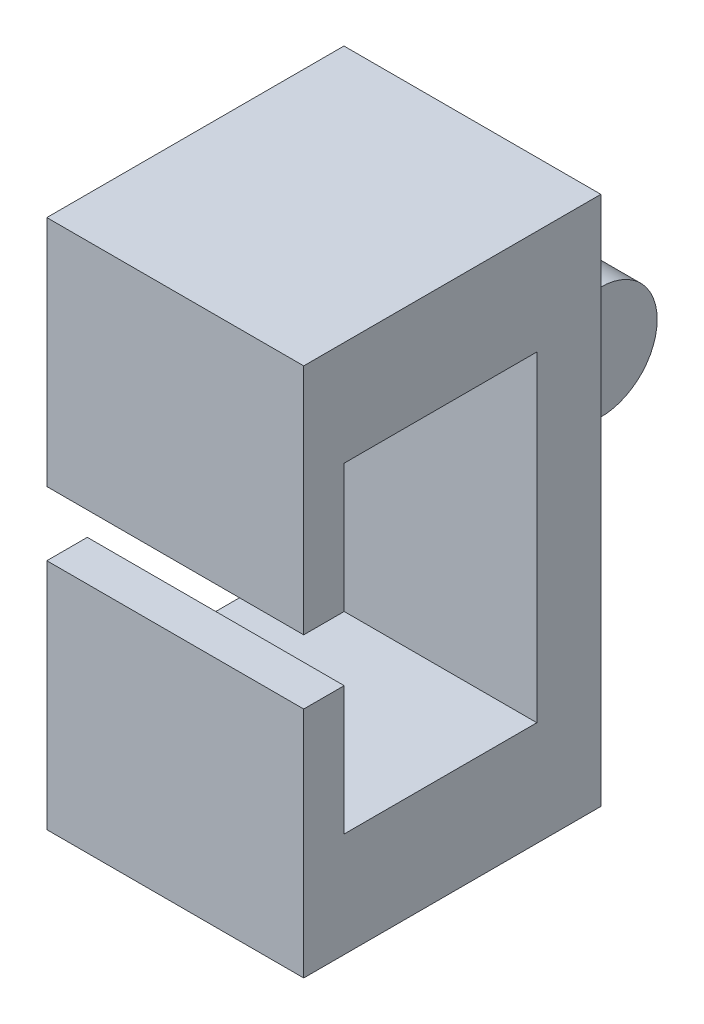
ISO-10303-21;
HEADER;
FILE_DESCRIPTION(('STEP AP214'),'2;1');
FILE_NAME('part.step','',(''),(''),'','','');
FILE_SCHEMA(('AUTOMOTIVE_DESIGN { 1 0 10303 214 1 1 1 1 }'));
ENDSEC;
DATA;
#1=APPLICATION_CONTEXT('core data for automotive mechanical design processes');
#2=APPLICATION_PROTOCOL_DEFINITION('international standard','automotive_design',2000,#1);
#3=PRODUCT_CONTEXT('',#1,'mechanical');
#4=PRODUCT('Part','Part','',(#3));
#5=PRODUCT_RELATED_PRODUCT_CATEGORY('part','',(#4));
#6=PRODUCT_DEFINITION_FORMATION('','',#4);
#7=PRODUCT_DEFINITION_CONTEXT('part definition',#1,'design');
#8=PRODUCT_DEFINITION('design','',#6,#7);
#9=PRODUCT_DEFINITION_SHAPE('','',#8);
#10=(LENGTH_UNIT() NAMED_UNIT(*) SI_UNIT(.MILLI.,.METRE.));
#11=(NAMED_UNIT(*) PLANE_ANGLE_UNIT() SI_UNIT($,.RADIAN.));
#12=(NAMED_UNIT(*) SI_UNIT($,.STERADIAN.) SOLID_ANGLE_UNIT());
#13=UNCERTAINTY_MEASURE_WITH_UNIT(LENGTH_MEASURE(1.E-05),#10,'distance_accuracy_value','');
#14=(GEOMETRIC_REPRESENTATION_CONTEXT(3) GLOBAL_UNCERTAINTY_ASSIGNED_CONTEXT((#13)) GLOBAL_UNIT_ASSIGNED_CONTEXT((#10,
#11,#12)) REPRESENTATION_CONTEXT('',''));
#15=CARTESIAN_POINT('',(0.,0.,0.));
#16=DIRECTION('',(0.,0.,1.));
#17=DIRECTION('',(1.,0.,0.));
#18=AXIS2_PLACEMENT_3D('',#15,#16,#17);
#19=CARTESIAN_POINT('',(25.4,0.,0.));
#20=DIRECTION('',(-1.,0.,0.));
#21=DIRECTION('',(0.,0.,1.));
#22=AXIS2_PLACEMENT_3D('',#19,#20,#21);
#23=CYLINDRICAL_SURFACE('',#22,11.1361216276526);
#24=CARTESIAN_POINT('',(25.4,0.,0.));
#25=DIRECTION('',(1.,0.,0.));
#26=DIRECTION('',(0.,0.,-1.));
#27=AXIS2_PLACEMENT_3D('',#24,#25,#26);
#28=CIRCLE('',#27,11.1361216276526);
#29=CARTESIAN_POINT('',(25.4,0.,-11.1361216276526));
#30=VERTEX_POINT('',#29);
#31=EDGE_CURVE('E153',#30,#30,#28,.T.);
#32=ORIENTED_EDGE('',*,*,#31,.F.);
#33=EDGE_LOOP('',(#32));
#34=FACE_BOUND('',#33,.T.);
#35=DIRECTION('',(-1.,0.,0.));
#36=VECTOR('',#35,1.);
#37=CARTESIAN_POINT('',(3.83463556575211,11.1361216276526,0.));
#38=LINE('',#37,#36);
#39=CARTESIAN_POINT('',(3.83463556575211,11.1361216276526,0.));
#40=VERTEX_POINT('',#39);
#41=CARTESIAN_POINT('',(0.,11.1361216276526,0.));
#42=VERTEX_POINT('',#41);
#43=EDGE_CURVE('E399',#40,#42,#38,.T.);
#44=ORIENTED_EDGE('',*,*,#43,.F.);
#45=CARTESIAN_POINT('',(3.83463556575211,0.,0.));
#46=DIRECTION('',(-1.,0.,0.));
#47=DIRECTION('',(0.,0.,1.));
#48=AXIS2_PLACEMENT_3D('',#45,#46,#47);
#49=CIRCLE('',#48,11.1361216276526);
#50=CARTESIAN_POINT('',(3.83463556575211,-11.1252,0.493082007248803));
#51=VERTEX_POINT('',#50);
#52=EDGE_CURVE('E13',#51,#40,#49,.T.);
#53=ORIENTED_EDGE('',*,*,#52,.F.);
#54=DIRECTION('',(-1.,0.,0.));
#55=VECTOR('',#54,1.);
#56=CARTESIAN_POINT('',(25.4,-11.1252,0.493082007248858));
#57=LINE('',#56,#55);
#58=CARTESIAN_POINT('',(0.,-11.1252,0.493082007248803));
#59=VERTEX_POINT('',#58);
#60=EDGE_CURVE('E161',#51,#59,#57,.T.);
#61=ORIENTED_EDGE('',*,*,#60,.T.);
#62=CARTESIAN_POINT('',(0.,0.,0.));
#63=DIRECTION('',(1.,0.,0.));
#64=DIRECTION('',(0.,0.,-1.));
#65=AXIS2_PLACEMENT_3D('',#62,#63,#64);
#66=CIRCLE('',#65,11.1361216276526);
#67=EDGE_CURVE('E408',#59,#42,#66,.T.);
#68=ORIENTED_EDGE('',*,*,#67,.T.);
#69=EDGE_LOOP('',(#44,#53,#61,#68));
#70=FACE_BOUND('',#69,.T.);
#71=ADVANCED_FACE('F143',(#34,#70),#23,.T.);
#72=CARTESIAN_POINT('',(25.4,0.,0.));
#73=DIRECTION('',(1.,0.,0.));
#74=DIRECTION('',(0.,0.,-1.));
#75=AXIS2_PLACEMENT_3D('',#72,#73,#74);
#76=PLANE('',#75);
#77=ORIENTED_EDGE('',*,*,#31,.T.);
#78=EDGE_LOOP('',(#77));
#79=FACE_BOUND('',#78,.T.);
#80=ADVANCED_FACE('F552',(#79),#76,.T.);
#81=CARTESIAN_POINT('',(0.,0.,0.));
#82=DIRECTION('',(1.,0.,0.));
#83=DIRECTION('',(0.,0.,-1.));
#84=AXIS2_PLACEMENT_3D('',#81,#82,#83);
#85=PLANE('',#84);
#86=ORIENTED_EDGE('',*,*,#67,.F.);
#87=DIRECTION('',(0.,0.,1.));
#88=VECTOR('',#87,1.);
#89=CARTESIAN_POINT('',(0.,-11.1252,0.));
#90=LINE('',#89,#88);
#91=CARTESIAN_POINT('',(0.,-11.1252,25.4));
#92=VERTEX_POINT('',#91);
#93=EDGE_CURVE('E378',#59,#92,#90,.T.);
#94=ORIENTED_EDGE('',*,*,#93,.T.);
#95=DIRECTION('',(0.,1.,0.));
#96=VECTOR('',#95,1.);
#97=CARTESIAN_POINT('',(0.,-31.75,25.4));
#98=LINE('',#97,#96);
#99=CARTESIAN_POINT('',(0.,-52.4146964792465,25.4));
#100=VERTEX_POINT('',#99);
#101=EDGE_CURVE('E366',#100,#92,#98,.T.);
#102=ORIENTED_EDGE('',*,*,#101,.F.);
#103=DIRECTION('',(0.,0.,-1.));
#104=VECTOR('',#103,1.);
#105=CARTESIAN_POINT('',(0.,-52.4146964792465,25.4));
#106=LINE('',#105,#104);
#107=CARTESIAN_POINT('',(0.,-52.4146964792465,84.1578930477657));
#108=VERTEX_POINT('',#107);
#109=EDGE_CURVE('E467',#108,#100,#106,.T.);
#110=ORIENTED_EDGE('',*,*,#109,.F.);
#111=DIRECTION('',(0.,-1.,0.));
#112=VECTOR('',#111,1.);
#113=CARTESIAN_POINT('',(0.,-52.4146964792465,84.1578930477657));
#114=LINE('',#113,#112);
#115=CARTESIAN_POINT('',(0.,-6.35,84.1578930477657));
#116=VERTEX_POINT('',#115);
#117=EDGE_CURVE('E269',#116,#108,#114,.T.);
#118=ORIENTED_EDGE('',*,*,#117,.F.);
#119=DIRECTION('',(0.,0.,1.));
#120=VECTOR('',#119,1.);
#121=CARTESIAN_POINT('',(0.,-6.35,76.1544905159104));
#122=LINE('',#121,#120);
#123=CARTESIAN_POINT('',(0.,-6.35,76.1544905159104));
#124=VERTEX_POINT('',#123);
#125=EDGE_CURVE('E295',#124,#116,#122,.T.);
#126=ORIENTED_EDGE('',*,*,#125,.F.);
#127=DIRECTION('',(0.,1.,0.));
#128=VECTOR('',#127,1.);
#129=CARTESIAN_POINT('',(0.,-52.4146964792465,76.1544905159105));
#130=LINE('',#129,#128);
#131=CARTESIAN_POINT('',(0.,-31.75,76.1544905159105));
#132=VERTEX_POINT('',#131);
#133=EDGE_CURVE('E271',#132,#124,#130,.T.);
#134=ORIENTED_EDGE('',*,*,#133,.F.);
#135=DIRECTION('',(0.,0.,1.));
#136=VECTOR('',#135,1.);
#137=CARTESIAN_POINT('',(0.,-31.75,25.4));
#138=LINE('',#137,#136);
#139=CARTESIAN_POINT('',(0.,-31.75,38.0544905159105));
#140=VERTEX_POINT('',#139);
#141=EDGE_CURVE('E350',#140,#132,#138,.T.);
#142=ORIENTED_EDGE('',*,*,#141,.F.);
#143=DIRECTION('',(0.,-1.,0.));
#144=VECTOR('',#143,1.);
#145=CARTESIAN_POINT('',(0.,-31.75,38.0544905159105));
#146=LINE('',#145,#144);
#147=CARTESIAN_POINT('',(0.,31.75,38.0544905159105));
#148=VERTEX_POINT('',#147);
#149=EDGE_CURVE('E365',#148,#140,#146,.T.);
#150=ORIENTED_EDGE('',*,*,#149,.F.);
#151=DIRECTION('',(0.,0.,-1.));
#152=VECTOR('',#151,1.);
#153=CARTESIAN_POINT('',(0.,31.75,25.4));
#154=LINE('',#153,#152);
#155=CARTESIAN_POINT('',(0.,31.75,76.1544905159105));
#156=VERTEX_POINT('',#155);
#157=EDGE_CURVE('E345',#156,#148,#154,.T.);
#158=ORIENTED_EDGE('',*,*,#157,.F.);
#159=DIRECTION('',(0.,1.,0.));
#160=VECTOR('',#159,1.);
#161=CARTESIAN_POINT('',(0.,52.4146964792465,76.1544905159105));
#162=LINE('',#161,#160);
#163=CARTESIAN_POINT('',(0.,6.35,76.1544905159105));
#164=VERTEX_POINT('',#163);
#165=EDGE_CURVE('E322',#164,#156,#162,.T.);
#166=ORIENTED_EDGE('',*,*,#165,.F.);
#167=DIRECTION('',(0.,0.,-1.));
#168=VECTOR('',#167,1.);
#169=CARTESIAN_POINT('',(0.,6.35,76.1544905159105));
#170=LINE('',#169,#168);
#171=CARTESIAN_POINT('',(0.,6.35,84.1578930477657));
#172=VERTEX_POINT('',#171);
#173=EDGE_CURVE('E321',#172,#164,#170,.T.);
#174=ORIENTED_EDGE('',*,*,#173,.F.);
#175=DIRECTION('',(0.,-1.,0.));
#176=VECTOR('',#175,1.);
#177=CARTESIAN_POINT('',(0.,52.4146964792465,84.1578930477657));
#178=LINE('',#177,#176);
#179=CARTESIAN_POINT('',(0.,52.4146964792465,84.1578930477657));
#180=VERTEX_POINT('',#179);
#181=EDGE_CURVE('E294',#180,#172,#178,.T.);
#182=ORIENTED_EDGE('',*,*,#181,.F.);
#183=DIRECTION('',(0.,0.,1.));
#184=VECTOR('',#183,1.);
#185=CARTESIAN_POINT('',(0.,52.4146964792465,25.4));
#186=LINE('',#185,#184);
#187=CARTESIAN_POINT('',(0.,52.4146964792465,25.4));
#188=VERTEX_POINT('',#187);
#189=EDGE_CURVE('E347',#188,#180,#186,.T.);
#190=ORIENTED_EDGE('',*,*,#189,.F.);
#191=CARTESIAN_POINT('',(0.,11.1361216276526,25.4));
#192=VERTEX_POINT('',#191);
#193=EDGE_CURVE('E367',#192,#188,#98,.T.);
#194=ORIENTED_EDGE('',*,*,#193,.F.);
#195=DIRECTION('',(0.,0.,1.));
#196=VECTOR('',#195,1.);
#197=CARTESIAN_POINT('',(0.,11.1361216276526,0.));
#198=LINE('',#197,#196);
#199=EDGE_CURVE('E383',#42,#192,#198,.T.);
#200=ORIENTED_EDGE('',*,*,#199,.F.);
#201=EDGE_LOOP('',(#86,#94,#102,#110,#118,#126,#134,#142,#150,#158,#166,#174,#182,#190,#194,#200));
#202=FACE_BOUND('',#201,.T.);
#203=ADVANCED_FACE('F428',(#202),#85,.F.);
#204=CARTESIAN_POINT('',(3.83463556575211,-11.1252,0.));
#205=DIRECTION('',(0.,-1.,0.));
#206=DIRECTION('',(0.,0.,-1.));
#207=AXIS2_PLACEMENT_3D('',#204,#205,#206);
#208=PLANE('',#207);
#209=ORIENTED_EDGE('',*,*,#60,.F.);
#210=DIRECTION('',(0.,0.,1.));
#211=VECTOR('',#210,1.);
#212=CARTESIAN_POINT('',(3.83463556575211,-11.1252,0.));
#213=LINE('',#212,#211);
#214=CARTESIAN_POINT('',(3.83463556575211,-11.1252,25.4));
#215=VERTEX_POINT('',#214);
#216=EDGE_CURVE('E379',#51,#215,#213,.T.);
#217=ORIENTED_EDGE('',*,*,#216,.T.);
#218=DIRECTION('',(-1.,0.,0.));
#219=VECTOR('',#218,1.);
#220=CARTESIAN_POINT('',(3.83463556575211,-11.1252,25.4));
#221=LINE('',#220,#219);
#222=EDGE_CURVE('E395',#215,#92,#221,.T.);
#223=ORIENTED_EDGE('',*,*,#222,.T.);
#224=ORIENTED_EDGE('',*,*,#93,.F.);
#225=EDGE_LOOP('',(#209,#217,#223,#224));
#226=FACE_BOUND('',#225,.T.);
#227=ADVANCED_FACE('F563',(#226),#208,.T.);
#228=CARTESIAN_POINT('',(3.83463556575211,11.1361216276526,0.));
#229=DIRECTION('',(0.,-1.,0.));
#230=DIRECTION('',(0.,0.,-1.));
#231=AXIS2_PLACEMENT_3D('',#228,#229,#230);
#232=PLANE('',#231);
#233=ORIENTED_EDGE('',*,*,#199,.T.);
#234=DIRECTION('',(-1.,0.,0.));
#235=VECTOR('',#234,1.);
#236=CARTESIAN_POINT('',(3.83463556575211,11.1361216276526,25.4));
#237=LINE('',#236,#235);
#238=CARTESIAN_POINT('',(3.83463556575211,11.1361216276526,25.4));
#239=VERTEX_POINT('',#238);
#240=EDGE_CURVE('E402',#239,#192,#237,.T.);
#241=ORIENTED_EDGE('',*,*,#240,.F.);
#242=DIRECTION('',(0.,0.,1.));
#243=VECTOR('',#242,1.);
#244=CARTESIAN_POINT('',(3.83463556575211,11.1361216276526,0.));
#245=LINE('',#244,#243);
#246=EDGE_CURVE('E386',#40,#239,#245,.T.);
#247=ORIENTED_EDGE('',*,*,#246,.F.);
#248=ORIENTED_EDGE('',*,*,#43,.T.);
#249=EDGE_LOOP('',(#233,#241,#247,#248));
#250=FACE_BOUND('',#249,.T.);
#251=ADVANCED_FACE('F421',(#250),#232,.F.);
#252=CARTESIAN_POINT('',(3.83463556575211,0.,0.));
#253=DIRECTION('',(-1.,0.,0.));
#254=DIRECTION('',(0.,0.,1.));
#255=AXIS2_PLACEMENT_3D('',#252,#253,#254);
#256=PLANE('',#255);
#257=ORIENTED_EDGE('',*,*,#216,.F.);
#258=ORIENTED_EDGE('',*,*,#52,.T.);
#259=ORIENTED_EDGE('',*,*,#246,.T.);
#260=DIRECTION('',(0.,-1.,0.));
#261=VECTOR('',#260,1.);
#262=CARTESIAN_POINT('',(3.83463556575211,11.1361216276526,25.4));
#263=LINE('',#262,#261);
#264=EDGE_CURVE('E381',#239,#215,#263,.T.);
#265=ORIENTED_EDGE('',*,*,#264,.T.);
#266=EDGE_LOOP('',(#257,#258,#259,#265));
#267=FACE_BOUND('',#266,.T.);
#268=ADVANCED_FACE('F569',(#267),#256,.F.);
#269=CARTESIAN_POINT('',(50.8,-31.75,25.4));
#270=DIRECTION('',(0.,0.,1.));
#271=DIRECTION('',(1.,0.,0.));
#272=AXIS2_PLACEMENT_3D('',#269,#270,#271);
#273=PLANE('',#272);
#274=ORIENTED_EDGE('',*,*,#222,.F.);
#275=ORIENTED_EDGE('',*,*,#264,.F.);
#276=ORIENTED_EDGE('',*,*,#240,.T.);
#277=ORIENTED_EDGE('',*,*,#193,.T.);
#278=DIRECTION('',(-1.,0.,0.));
#279=VECTOR('',#278,1.);
#280=CARTESIAN_POINT('',(50.8,52.4146964792465,25.4));
#281=LINE('',#280,#279);
#282=CARTESIAN_POINT('',(50.8,52.4146964792465,25.4));
#283=VERTEX_POINT('',#282);
#284=EDGE_CURVE('E280',#283,#188,#281,.T.);
#285=ORIENTED_EDGE('',*,*,#284,.F.);
#286=DIRECTION('',(0.,1.,0.));
#287=VECTOR('',#286,1.);
#288=CARTESIAN_POINT('',(50.8,-31.75,25.4));
#289=LINE('',#288,#287);
#290=CARTESIAN_POINT('',(50.8,-52.4146964792465,25.4));
#291=VERTEX_POINT('',#290);
#292=EDGE_CURVE('E356',#291,#283,#289,.T.);
#293=ORIENTED_EDGE('',*,*,#292,.F.);
#294=DIRECTION('',(-1.,0.,0.));
#295=VECTOR('',#294,1.);
#296=CARTESIAN_POINT('',(50.8,-52.4146964792465,25.4));
#297=LINE('',#296,#295);
#298=EDGE_CURVE('E436',#291,#100,#297,.T.);
#299=ORIENTED_EDGE('',*,*,#298,.T.);
#300=ORIENTED_EDGE('',*,*,#101,.T.);
#301=EDGE_LOOP('',(#274,#275,#276,#277,#285,#293,#299,#300));
#302=FACE_BOUND('',#301,.T.);
#303=ADVANCED_FACE('F575',(#302),#273,.F.);
#304=CARTESIAN_POINT('',(50.8,-31.75,38.0544905159105));
#305=DIRECTION('',(0.,0.,-1.));
#306=DIRECTION('',(-1.,0.,0.));
#307=AXIS2_PLACEMENT_3D('',#304,#305,#306);
#308=PLANE('',#307);
#309=ORIENTED_EDGE('',*,*,#149,.T.);
#310=DIRECTION('',(-1.,0.,0.));
#311=VECTOR('',#310,1.);
#312=CARTESIAN_POINT('',(50.8,-31.75,38.0544905159105));
#313=LINE('',#312,#311);
#314=CARTESIAN_POINT('',(50.8,-31.75,38.0544905159105));
#315=VERTEX_POINT('',#314);
#316=EDGE_CURVE('E362',#315,#140,#313,.T.);
#317=ORIENTED_EDGE('',*,*,#316,.F.);
#318=DIRECTION('',(0.,-1.,0.));
#319=VECTOR('',#318,1.);
#320=CARTESIAN_POINT('',(50.8,-31.75,38.0544905159105));
#321=LINE('',#320,#319);
#322=CARTESIAN_POINT('',(50.8,31.75,38.0544905159105));
#323=VERTEX_POINT('',#322);
#324=EDGE_CURVE('E363',#323,#315,#321,.T.);
#325=ORIENTED_EDGE('',*,*,#324,.F.);
#326=DIRECTION('',(-1.,0.,0.));
#327=VECTOR('',#326,1.);
#328=CARTESIAN_POINT('',(50.8,31.75,38.0544905159105));
#329=LINE('',#328,#327);
#330=EDGE_CURVE('E376',#323,#148,#329,.T.);
#331=ORIENTED_EDGE('',*,*,#330,.T.);
#332=EDGE_LOOP('',(#309,#317,#325,#331));
#333=FACE_BOUND('',#332,.T.);
#334=ADVANCED_FACE('F462',(#333),#308,.F.);
#335=CARTESIAN_POINT('',(50.8,0.,0.));
#336=DIRECTION('',(-1.,0.,0.));
#337=DIRECTION('',(0.,0.,1.));
#338=AXIS2_PLACEMENT_3D('',#335,#336,#337);
#339=PLANE('',#338);
#340=ORIENTED_EDGE('',*,*,#324,.T.);
#341=DIRECTION('',(0.,0.,1.));
#342=VECTOR('',#341,1.);
#343=CARTESIAN_POINT('',(50.8,-31.75,25.4));
#344=LINE('',#343,#342);
#345=CARTESIAN_POINT('',(50.8,-31.75,76.1544905159105));
#346=VERTEX_POINT('',#345);
#347=EDGE_CURVE('E265',#315,#346,#344,.T.);
#348=ORIENTED_EDGE('',*,*,#347,.T.);
#349=DIRECTION('',(0.,1.,0.));
#350=VECTOR('',#349,1.);
#351=CARTESIAN_POINT('',(50.8,-52.4146964792465,76.1544905159105));
#352=LINE('',#351,#350);
#353=CARTESIAN_POINT('',(50.8,-6.35,76.1544905159104));
#354=VERTEX_POINT('',#353);
#355=EDGE_CURVE('E251',#346,#354,#352,.T.);
#356=ORIENTED_EDGE('',*,*,#355,.T.);
#357=DIRECTION('',(0.,0.,1.));
#358=VECTOR('',#357,1.);
#359=CARTESIAN_POINT('',(50.8,-6.35,76.1544905159104));
#360=LINE('',#359,#358);
#361=CARTESIAN_POINT('',(50.8,-6.35,84.1578930477657));
#362=VERTEX_POINT('',#361);
#363=EDGE_CURVE('E256',#354,#362,#360,.T.);
#364=ORIENTED_EDGE('',*,*,#363,.T.);
#365=DIRECTION('',(0.,-1.,0.));
#366=VECTOR('',#365,1.);
#367=CARTESIAN_POINT('',(50.8,-52.4146964792465,84.1578930477657));
#368=LINE('',#367,#366);
#369=CARTESIAN_POINT('',(50.8,-52.4146964792465,84.1578930477657));
#370=VERTEX_POINT('',#369);
#371=EDGE_CURVE('E283',#362,#370,#368,.T.);
#372=ORIENTED_EDGE('',*,*,#371,.T.);
#373=DIRECTION('',(0.,0.,-1.));
#374=VECTOR('',#373,1.);
#375=CARTESIAN_POINT('',(50.8,-52.4146964792465,25.4));
#376=LINE('',#375,#374);
#377=EDGE_CURVE('E441',#370,#291,#376,.T.);
#378=ORIENTED_EDGE('',*,*,#377,.T.);
#379=ORIENTED_EDGE('',*,*,#292,.T.);
#380=DIRECTION('',(0.,0.,1.));
#381=VECTOR('',#380,1.);
#382=CARTESIAN_POINT('',(50.8,52.4146964792465,25.4));
#383=LINE('',#382,#381);
#384=CARTESIAN_POINT('',(50.8,52.4146964792465,84.1578930477657));
#385=VERTEX_POINT('',#384);
#386=EDGE_CURVE('E349',#283,#385,#383,.T.);
#387=ORIENTED_EDGE('',*,*,#386,.T.);
#388=DIRECTION('',(0.,-1.,0.));
#389=VECTOR('',#388,1.);
#390=CARTESIAN_POINT('',(50.8,52.4146964792465,84.1578930477657));
#391=LINE('',#390,#389);
#392=CARTESIAN_POINT('',(50.8,6.35,84.1578930477657));
#393=VERTEX_POINT('',#392);
#394=EDGE_CURVE('E323',#385,#393,#391,.T.);
#395=ORIENTED_EDGE('',*,*,#394,.T.);
#396=DIRECTION('',(0.,0.,-1.));
#397=VECTOR('',#396,1.);
#398=CARTESIAN_POINT('',(50.8,6.35,76.1544905159105));
#399=LINE('',#398,#397);
#400=CARTESIAN_POINT('',(50.8,6.35,76.1544905159105));
#401=VERTEX_POINT('',#400);
#402=EDGE_CURVE('E335',#393,#401,#399,.T.);
#403=ORIENTED_EDGE('',*,*,#402,.T.);
#404=DIRECTION('',(0.,1.,0.));
#405=VECTOR('',#404,1.);
#406=CARTESIAN_POINT('',(50.8,52.4146964792465,76.1544905159105));
#407=LINE('',#406,#405);
#408=CARTESIAN_POINT('',(50.8,31.75,76.1544905159105));
#409=VERTEX_POINT('',#408);
#410=EDGE_CURVE('E318',#401,#409,#407,.T.);
#411=ORIENTED_EDGE('',*,*,#410,.T.);
#412=DIRECTION('',(0.,0.,-1.));
#413=VECTOR('',#412,1.);
#414=CARTESIAN_POINT('',(50.8,31.75,25.4));
#415=LINE('',#414,#413);
#416=EDGE_CURVE('E351',#409,#323,#415,.T.);
#417=ORIENTED_EDGE('',*,*,#416,.T.);
#418=EDGE_LOOP('',(#340,#348,#356,#364,#372,#378,#379,#387,#395,#403,#411,#417));
#419=FACE_BOUND('',#418,.T.);
#420=ADVANCED_FACE('F257',(#419),#339,.F.);
#421=CARTESIAN_POINT('',(50.8,31.75,25.4));
#422=DIRECTION('',(0.,1.,0.));
#423=DIRECTION('',(0.,0.,1.));
#424=AXIS2_PLACEMENT_3D('',#421,#422,#423);
#425=PLANE('',#424);
#426=ORIENTED_EDGE('',*,*,#330,.F.);
#427=ORIENTED_EDGE('',*,*,#416,.F.);
#428=DIRECTION('',(-1.,0.,0.));
#429=VECTOR('',#428,1.);
#430=CARTESIAN_POINT('',(50.8,31.75,76.1544905159105));
#431=LINE('',#430,#429);
#432=EDGE_CURVE('E354',#409,#156,#431,.T.);
#433=ORIENTED_EDGE('',*,*,#432,.T.);
#434=ORIENTED_EDGE('',*,*,#157,.T.);
#435=EDGE_LOOP('',(#426,#427,#433,#434));
#436=FACE_BOUND('',#435,.T.);
#437=ADVANCED_FACE('F455',(#436),#425,.F.);
#438=CARTESIAN_POINT('',(50.8,52.4146964792465,25.4));
#439=DIRECTION('',(0.,-1.,0.));
#440=DIRECTION('',(0.,0.,-1.));
#441=AXIS2_PLACEMENT_3D('',#438,#439,#440);
#442=PLANE('',#441);
#443=ORIENTED_EDGE('',*,*,#189,.T.);
#444=DIRECTION('',(-1.,0.,0.));
#445=VECTOR('',#444,1.);
#446=CARTESIAN_POINT('',(50.8,52.4146964792465,84.1578930477657));
#447=LINE('',#446,#445);
#448=EDGE_CURVE('E308',#385,#180,#447,.T.);
#449=ORIENTED_EDGE('',*,*,#448,.F.);
#450=ORIENTED_EDGE('',*,*,#386,.F.);
#451=ORIENTED_EDGE('',*,*,#284,.T.);
#452=EDGE_LOOP('',(#443,#449,#450,#451));
#453=FACE_BOUND('',#452,.T.);
#454=ADVANCED_FACE('F576',(#453),#442,.F.);
#455=CARTESIAN_POINT('',(50.8,-31.75,25.4));
#456=DIRECTION('',(0.,-1.,0.));
#457=DIRECTION('',(0.,0.,-1.));
#458=AXIS2_PLACEMENT_3D('',#455,#456,#457);
#459=PLANE('',#458);
#460=ORIENTED_EDGE('',*,*,#347,.F.);
#461=ORIENTED_EDGE('',*,*,#316,.T.);
#462=ORIENTED_EDGE('',*,*,#141,.T.);
#463=DIRECTION('',(-1.,0.,0.));
#464=VECTOR('',#463,1.);
#465=CARTESIAN_POINT('',(50.8,-31.75,76.1544905159105));
#466=LINE('',#465,#464);
#467=EDGE_CURVE('E433',#346,#132,#466,.T.);
#468=ORIENTED_EDGE('',*,*,#467,.F.);
#469=EDGE_LOOP('',(#460,#461,#462,#468));
#470=FACE_BOUND('',#469,.T.);
#471=ADVANCED_FACE('F461',(#470),#459,.F.);
#472=CARTESIAN_POINT('',(50.8,-52.4146964792465,25.4));
#473=DIRECTION('',(0.,1.,0.));
#474=DIRECTION('',(0.,0.,1.));
#475=AXIS2_PLACEMENT_3D('',#472,#473,#474);
#476=PLANE('',#475);
#477=ORIENTED_EDGE('',*,*,#109,.T.);
#478=ORIENTED_EDGE('',*,*,#298,.F.);
#479=ORIENTED_EDGE('',*,*,#377,.F.);
#480=DIRECTION('',(-1.,0.,0.));
#481=VECTOR('',#480,1.);
#482=CARTESIAN_POINT('',(50.8,-52.4146964792465,84.1578930477657));
#483=LINE('',#482,#481);
#484=EDGE_CURVE('E286',#370,#108,#483,.T.);
#485=ORIENTED_EDGE('',*,*,#484,.T.);
#486=EDGE_LOOP('',(#477,#478,#479,#485));
#487=FACE_BOUND('',#486,.T.);
#488=ADVANCED_FACE('F586',(#487),#476,.F.);
#489=CARTESIAN_POINT('',(50.8,-52.4146964792465,76.1544905159105));
#490=DIRECTION('',(0.,0.,1.));
#491=DIRECTION('',(0.,-1.,0.));
#492=AXIS2_PLACEMENT_3D('',#489,#490,#491);
#493=PLANE('',#492);
#494=ORIENTED_EDGE('',*,*,#355,.F.);
#495=ORIENTED_EDGE('',*,*,#467,.T.);
#496=ORIENTED_EDGE('',*,*,#133,.T.);
#497=DIRECTION('',(-1.,0.,0.));
#498=VECTOR('',#497,1.);
#499=CARTESIAN_POINT('',(50.8,-6.35,76.1544905159104));
#500=LINE('',#499,#498);
#501=EDGE_CURVE('E268',#354,#124,#500,.T.);
#502=ORIENTED_EDGE('',*,*,#501,.F.);
#503=EDGE_LOOP('',(#494,#495,#496,#502));
#504=FACE_BOUND('',#503,.T.);
#505=ADVANCED_FACE('F272',(#504),#493,.F.);
#506=CARTESIAN_POINT('',(50.8,-6.35,76.1544905159104));
#507=DIRECTION('',(0.,-1.,0.));
#508=DIRECTION('',(0.,0.,-1.));
#509=AXIS2_PLACEMENT_3D('',#506,#507,#508);
#510=PLANE('',#509);
#511=ORIENTED_EDGE('',*,*,#125,.T.);
#512=DIRECTION('',(-1.,0.,0.));
#513=VECTOR('',#512,1.);
#514=CARTESIAN_POINT('',(50.8,-6.35,84.1578930477657));
#515=LINE('',#514,#513);
#516=EDGE_CURVE('E279',#362,#116,#515,.T.);
#517=ORIENTED_EDGE('',*,*,#516,.F.);
#518=ORIENTED_EDGE('',*,*,#363,.F.);
#519=ORIENTED_EDGE('',*,*,#501,.T.);
#520=EDGE_LOOP('',(#511,#517,#518,#519));
#521=FACE_BOUND('',#520,.T.);
#522=ADVANCED_FACE('F278',(#521),#510,.F.);
#523=CARTESIAN_POINT('',(50.8,-52.4146964792465,84.1578930477657));
#524=DIRECTION('',(0.,0.,-1.));
#525=DIRECTION('',(-1.,0.,0.));
#526=AXIS2_PLACEMENT_3D('',#523,#524,#525);
#527=PLANE('',#526);
#528=ORIENTED_EDGE('',*,*,#117,.T.);
#529=ORIENTED_EDGE('',*,*,#484,.F.);
#530=ORIENTED_EDGE('',*,*,#371,.F.);
#531=ORIENTED_EDGE('',*,*,#516,.T.);
#532=EDGE_LOOP('',(#528,#529,#530,#531));
#533=FACE_BOUND('',#532,.T.);
#534=ADVANCED_FACE('F598',(#533),#527,.F.);
#535=CARTESIAN_POINT('',(50.8,52.4146964792465,84.1578930477657));
#536=DIRECTION('',(0.,0.,-1.));
#537=DIRECTION('',(0.,1.,0.));
#538=AXIS2_PLACEMENT_3D('',#535,#536,#537);
#539=PLANE('',#538);
#540=ORIENTED_EDGE('',*,*,#181,.T.);
#541=DIRECTION('',(-1.,0.,0.));
#542=VECTOR('',#541,1.);
#543=CARTESIAN_POINT('',(50.8,6.35,84.1578930477657));
#544=LINE('',#543,#542);
#545=EDGE_CURVE('E315',#393,#172,#544,.T.);
#546=ORIENTED_EDGE('',*,*,#545,.F.);
#547=ORIENTED_EDGE('',*,*,#394,.F.);
#548=ORIENTED_EDGE('',*,*,#448,.T.);
#549=EDGE_LOOP('',(#540,#546,#547,#548));
#550=FACE_BOUND('',#549,.T.);
#551=ADVANCED_FACE('F538',(#550),#539,.F.);
#552=CARTESIAN_POINT('',(50.8,6.35,76.1544905159105));
#553=DIRECTION('',(0.,1.,0.));
#554=DIRECTION('',(0.,0.,1.));
#555=AXIS2_PLACEMENT_3D('',#552,#553,#554);
#556=PLANE('',#555);
#557=ORIENTED_EDGE('',*,*,#173,.T.);
#558=DIRECTION('',(-1.,0.,0.));
#559=VECTOR('',#558,1.);
#560=CARTESIAN_POINT('',(50.8,6.35,76.1544905159105));
#561=LINE('',#560,#559);
#562=EDGE_CURVE('E314',#401,#164,#561,.T.);
#563=ORIENTED_EDGE('',*,*,#562,.F.);
#564=ORIENTED_EDGE('',*,*,#402,.F.);
#565=ORIENTED_EDGE('',*,*,#545,.T.);
#566=EDGE_LOOP('',(#557,#563,#564,#565));
#567=FACE_BOUND('',#566,.T.);
#568=ADVANCED_FACE('F545',(#567),#556,.F.);
#569=CARTESIAN_POINT('',(50.8,52.4146964792465,76.1544905159105));
#570=DIRECTION('',(0.,0.,1.));
#571=DIRECTION('',(1.,0.,0.));
#572=AXIS2_PLACEMENT_3D('',#569,#570,#571);
#573=PLANE('',#572);
#574=ORIENTED_EDGE('',*,*,#432,.F.);
#575=ORIENTED_EDGE('',*,*,#410,.F.);
#576=ORIENTED_EDGE('',*,*,#562,.T.);
#577=ORIENTED_EDGE('',*,*,#165,.T.);
#578=EDGE_LOOP('',(#574,#575,#576,#577));
#579=FACE_BOUND('',#578,.T.);
#580=ADVANCED_FACE('F542',(#579),#573,.F.);
#581=CLOSED_SHELL('',(#71,#80,#203,#227,#251,#268,#303,#334,#420,#437,#454,#471,#488,#505,#522,
#534,#551,#568,#580));
#582=MANIFOLD_SOLID_BREP('B2',#581);
#583=ADVANCED_BREP_SHAPE_REPRESENTATION('',(#18,#582),#14);
#584=SHAPE_DEFINITION_REPRESENTATION(#9,#583);
ENDSEC;
END-ISO-10303-21;
